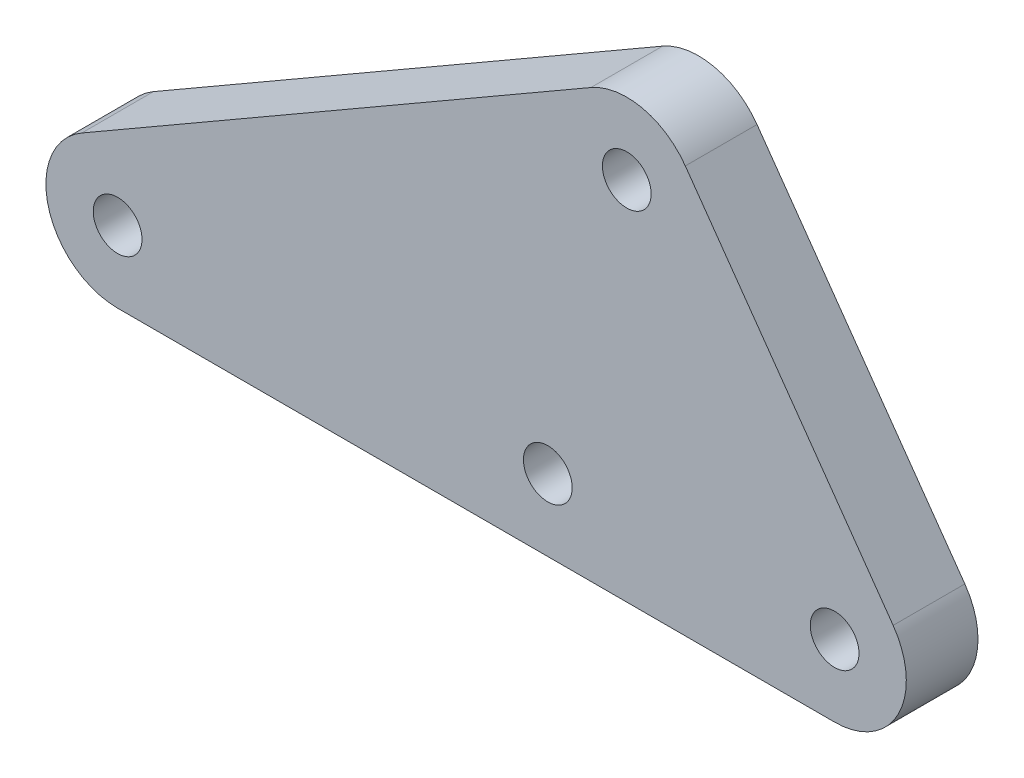
ISO-10303-21;
HEADER;
FILE_DESCRIPTION(('STEP AP214'),'2;1');
FILE_NAME('part.step','',(''),(''),'','','');
FILE_SCHEMA(('AUTOMOTIVE_DESIGN { 1 0 10303 214 1 1 1 1 }'));
ENDSEC;
DATA;
#1=APPLICATION_CONTEXT('core data for automotive mechanical design processes');
#2=APPLICATION_PROTOCOL_DEFINITION('international standard','automotive_design',2000,#1);
#3=PRODUCT_CONTEXT('',#1,'mechanical');
#4=PRODUCT('Part','Part','',(#3));
#5=PRODUCT_RELATED_PRODUCT_CATEGORY('part','',(#4));
#6=PRODUCT_DEFINITION_FORMATION('','',#4);
#7=PRODUCT_DEFINITION_CONTEXT('part definition',#1,'design');
#8=PRODUCT_DEFINITION('design','',#6,#7);
#9=PRODUCT_DEFINITION_SHAPE('','',#8);
#10=(LENGTH_UNIT() NAMED_UNIT(*) SI_UNIT(.MILLI.,.METRE.));
#11=(NAMED_UNIT(*) PLANE_ANGLE_UNIT() SI_UNIT($,.RADIAN.));
#12=(NAMED_UNIT(*) SI_UNIT($,.STERADIAN.) SOLID_ANGLE_UNIT());
#13=UNCERTAINTY_MEASURE_WITH_UNIT(LENGTH_MEASURE(1.E-05),#10,'distance_accuracy_value','');
#14=(GEOMETRIC_REPRESENTATION_CONTEXT(3) GLOBAL_UNCERTAINTY_ASSIGNED_CONTEXT((#13)) GLOBAL_UNIT_ASSIGNED_CONTEXT((#10,
#11,#12)) REPRESENTATION_CONTEXT('',''));
#15=CARTESIAN_POINT('',(0.,0.,0.));
#16=DIRECTION('',(0.,0.,1.));
#17=DIRECTION('',(1.,0.,0.));
#18=AXIS2_PLACEMENT_3D('',#15,#16,#17);
#19=CARTESIAN_POINT('',(-2.50000000000001,4.33012701892219,5.));
#20=DIRECTION('',(-0.500000000000001,0.866025403784438,0.));
#21=DIRECTION('',(-0.866025403784438,-0.500000000000001,0.));
#22=AXIS2_PLACEMENT_3D('',#19,#20,#21);
#23=PLANE('',#22);
#24=DIRECTION('',(0.866025403784438,0.500000000000001,0.));
#25=VECTOR('',#24,1.);
#26=CARTESIAN_POINT('',(-2.50000000000001,4.33012701892219,0.));
#27=LINE('',#26,#25);
#28=CARTESIAN_POINT('',(-2.50000000000001,4.33012701892219,0.));
#29=VERTEX_POINT('',#28);
#30=CARTESIAN_POINT('',(33.007041555162,24.8301270189223,0.));
#31=VERTEX_POINT('',#30);
#32=EDGE_CURVE('E130',#29,#31,#27,.T.);
#33=ORIENTED_EDGE('',*,*,#32,.F.);
#34=DIRECTION('',(0.,0.,-1.));
#35=VECTOR('',#34,1.);
#36=CARTESIAN_POINT('',(-2.50000000000001,4.33012701892219,5.));
#37=LINE('',#36,#35);
#38=CARTESIAN_POINT('',(-2.50000000000001,4.33012701892219,5.));
#39=VERTEX_POINT('',#38);
#40=EDGE_CURVE('E11',#39,#29,#37,.T.);
#41=ORIENTED_EDGE('',*,*,#40,.F.);
#42=DIRECTION('',(0.866025403784438,0.500000000000001,0.));
#43=VECTOR('',#42,1.);
#44=CARTESIAN_POINT('',(-2.50000000000001,4.33012701892219,5.));
#45=LINE('',#44,#43);
#46=CARTESIAN_POINT('',(33.007041555162,24.8301270189223,5.));
#47=VERTEX_POINT('',#46);
#48=EDGE_CURVE('E203',#39,#47,#45,.T.);
#49=ORIENTED_EDGE('',*,*,#48,.T.);
#50=DIRECTION('',(0.,0.,-1.));
#51=VECTOR('',#50,1.);
#52=CARTESIAN_POINT('',(33.007041555162,24.8301270189223,5.));
#53=LINE('',#52,#51);
#54=EDGE_CURVE('E80',#47,#31,#53,.T.);
#55=ORIENTED_EDGE('',*,*,#54,.T.);
#56=EDGE_LOOP('',(#33,#41,#49,#55));
#57=FACE_BOUND('',#56,.T.);
#58=ADVANCED_FACE('F35',(#57),#23,.T.);
#59=CARTESIAN_POINT('',(0.,0.,5.));
#60=DIRECTION('',(0.,0.,-1.));
#61=DIRECTION('',(-1.,0.,0.));
#62=AXIS2_PLACEMENT_3D('',#59,#60,#61);
#63=CYLINDRICAL_SURFACE('',#62,5.);
#64=CARTESIAN_POINT('',(0.,0.,0.));
#65=DIRECTION('',(0.,0.,1.));
#66=DIRECTION('',(1.,0.,0.));
#67=AXIS2_PLACEMENT_3D('',#64,#65,#66);
#68=CIRCLE('',#67,5.);
#69=CARTESIAN_POINT('',(0.,-5.,0.));
#70=VERTEX_POINT('',#69);
#71=EDGE_CURVE('E133',#29,#70,#68,.T.);
#72=ORIENTED_EDGE('',*,*,#71,.T.);
#73=DIRECTION('',(0.,0.,-1.));
#74=VECTOR('',#73,1.);
#75=CARTESIAN_POINT('',(0.,-5.,5.));
#76=LINE('',#75,#74);
#77=CARTESIAN_POINT('',(0.,-5.,5.));
#78=VERTEX_POINT('',#77);
#79=EDGE_CURVE('E44',#78,#70,#76,.T.);
#80=ORIENTED_EDGE('',*,*,#79,.F.);
#81=CARTESIAN_POINT('',(0.,0.,5.));
#82=DIRECTION('',(0.,0.,1.));
#83=DIRECTION('',(1.,0.,0.));
#84=AXIS2_PLACEMENT_3D('',#81,#82,#83);
#85=CIRCLE('',#84,5.);
#86=EDGE_CURVE('E205',#39,#78,#85,.T.);
#87=ORIENTED_EDGE('',*,*,#86,.F.);
#88=ORIENTED_EDGE('',*,*,#40,.T.);
#89=EDGE_LOOP('',(#72,#80,#87,#88));
#90=FACE_BOUND('',#89,.T.);
#91=ADVANCED_FACE('F162',(#90),#63,.T.);
#92=CARTESIAN_POINT('',(0.,-5.,5.));
#93=DIRECTION('',(0.,1.,0.));
#94=DIRECTION('',(-1.,0.,0.));
#95=AXIS2_PLACEMENT_3D('',#92,#93,#94);
#96=PLANE('',#95);
#97=DIRECTION('',(1.,0.,0.));
#98=VECTOR('',#97,1.);
#99=CARTESIAN_POINT('',(0.,-5.,0.));
#100=LINE('',#99,#98);
#101=CARTESIAN_POINT('',(50.,-5.,0.));
#102=VERTEX_POINT('',#101);
#103=EDGE_CURVE('E136',#70,#102,#100,.T.);
#104=ORIENTED_EDGE('',*,*,#103,.T.);
#105=DIRECTION('',(0.,0.,-1.));
#106=VECTOR('',#105,1.);
#107=CARTESIAN_POINT('',(50.,-5.,5.));
#108=LINE('',#107,#106);
#109=CARTESIAN_POINT('',(50.,-5.,5.));
#110=VERTEX_POINT('',#109);
#111=EDGE_CURVE('E111',#110,#102,#108,.T.);
#112=ORIENTED_EDGE('',*,*,#111,.F.);
#113=DIRECTION('',(1.,0.,0.));
#114=VECTOR('',#113,1.);
#115=CARTESIAN_POINT('',(0.,-5.,5.));
#116=LINE('',#115,#114);
#117=EDGE_CURVE('E99',#78,#110,#116,.T.);
#118=ORIENTED_EDGE('',*,*,#117,.F.);
#119=ORIENTED_EDGE('',*,*,#79,.T.);
#120=EDGE_LOOP('',(#104,#112,#118,#119));
#121=FACE_BOUND('',#120,.T.);
#122=ADVANCED_FACE('F159',(#121),#96,.F.);
#123=CARTESIAN_POINT('',(50.,0.,5.));
#124=DIRECTION('',(0.,0.,-1.));
#125=DIRECTION('',(-1.,0.,0.));
#126=AXIS2_PLACEMENT_3D('',#123,#124,#125);
#127=CYLINDRICAL_SURFACE('',#126,5.);
#128=CARTESIAN_POINT('',(50.,0.,0.));
#129=DIRECTION('',(0.,0.,1.));
#130=DIRECTION('',(1.,0.,0.));
#131=AXIS2_PLACEMENT_3D('',#128,#129,#130);
#132=CIRCLE('',#131,5.);
#133=CARTESIAN_POINT('',(54.0827392452916,2.8863887913717,0.));
#134=VERTEX_POINT('',#133);
#135=EDGE_CURVE('E107',#102,#134,#132,.T.);
#136=ORIENTED_EDGE('',*,*,#135,.T.);
#137=DIRECTION('',(0.,0.,-1.));
#138=VECTOR('',#137,1.);
#139=CARTESIAN_POINT('',(54.0827392452916,2.8863887913717,5.));
#140=LINE('',#139,#138);
#141=CARTESIAN_POINT('',(54.0827392452916,2.8863887913717,5.));
#142=VERTEX_POINT('',#141);
#143=EDGE_CURVE('E105',#142,#134,#140,.T.);
#144=ORIENTED_EDGE('',*,*,#143,.F.);
#145=CARTESIAN_POINT('',(50.,0.,5.));
#146=DIRECTION('',(0.,0.,1.));
#147=DIRECTION('',(1.,0.,0.));
#148=AXIS2_PLACEMENT_3D('',#145,#146,#147);
#149=CIRCLE('',#148,5.);
#150=EDGE_CURVE('E92',#110,#142,#149,.T.);
#151=ORIENTED_EDGE('',*,*,#150,.F.);
#152=ORIENTED_EDGE('',*,*,#111,.T.);
#153=EDGE_LOOP('',(#136,#144,#151,#152));
#154=FACE_BOUND('',#153,.T.);
#155=ADVANCED_FACE('F106',(#154),#127,.T.);
#156=CARTESIAN_POINT('',(37.4202587353792,26.4551343827774,5.));
#157=DIRECTION('',(0.816547849058311,0.577277758274339,0.));
#158=DIRECTION('',(-0.577277758274339,0.816547849058311,0.));
#159=AXIS2_PLACEMENT_3D('',#156,#157,#158);
#160=PLANE('',#159);
#161=DIRECTION('',(0.577277758274339,-0.816547849058311,0.));
#162=VECTOR('',#161,1.);
#163=CARTESIAN_POINT('',(37.4202587353792,26.4551343827774,0.));
#164=LINE('',#163,#162);
#165=CARTESIAN_POINT('',(39.5897808004535,23.3863887913718,0.));
#166=VERTEX_POINT('',#165);
#167=EDGE_CURVE('E140',#166,#134,#164,.T.);
#168=ORIENTED_EDGE('',*,*,#167,.F.);
#169=DIRECTION('',(0.,0.,-1.));
#170=VECTOR('',#169,1.);
#171=CARTESIAN_POINT('',(39.5897808004535,23.3863887913718,5.));
#172=LINE('',#171,#170);
#173=CARTESIAN_POINT('',(39.5897808004535,23.3863887913718,5.));
#174=VERTEX_POINT('',#173);
#175=EDGE_CURVE('E73',#174,#166,#172,.T.);
#176=ORIENTED_EDGE('',*,*,#175,.F.);
#177=DIRECTION('',(0.577277758274339,-0.816547849058311,0.));
#178=VECTOR('',#177,1.);
#179=CARTESIAN_POINT('',(37.4202587353792,26.4551343827774,5.));
#180=LINE('',#179,#178);
#181=EDGE_CURVE('E97',#174,#142,#180,.T.);
#182=ORIENTED_EDGE('',*,*,#181,.T.);
#183=ORIENTED_EDGE('',*,*,#143,.T.);
#184=EDGE_LOOP('',(#168,#176,#182,#183));
#185=FACE_BOUND('',#184,.T.);
#186=ADVANCED_FACE('F113',(#185),#160,.T.);
#187=CARTESIAN_POINT('',(0.,0.,5.));
#188=DIRECTION('',(0.,0.,-1.));
#189=DIRECTION('',(-1.,0.,0.));
#190=AXIS2_PLACEMENT_3D('',#187,#188,#189);
#191=CYLINDRICAL_SURFACE('',#190,1.7);
#192=CARTESIAN_POINT('',(0.,0.,5.));
#193=DIRECTION('',(0.,0.,1.));
#194=DIRECTION('',(1.,0.,0.));
#195=AXIS2_PLACEMENT_3D('',#192,#193,#194);
#196=CIRCLE('',#195,1.7);
#197=CARTESIAN_POINT('',(1.7,0.,5.));
#198=VERTEX_POINT('',#197);
#199=EDGE_CURVE('E121',#198,#198,#196,.T.);
#200=ORIENTED_EDGE('',*,*,#199,.T.);
#201=EDGE_LOOP('',(#200));
#202=FACE_BOUND('',#201,.T.);
#203=CARTESIAN_POINT('',(0.,0.,0.));
#204=DIRECTION('',(0.,0.,1.));
#205=DIRECTION('',(1.,0.,0.));
#206=AXIS2_PLACEMENT_3D('',#203,#204,#205);
#207=CIRCLE('',#206,1.7);
#208=CARTESIAN_POINT('',(1.7,0.,0.));
#209=VERTEX_POINT('',#208);
#210=EDGE_CURVE('E147',#209,#209,#207,.T.);
#211=ORIENTED_EDGE('',*,*,#210,.F.);
#212=EDGE_LOOP('',(#211));
#213=FACE_BOUND('',#212,.T.);
#214=ADVANCED_FACE('F178',(#202,#213),#191,.F.);
#215=CARTESIAN_POINT('',(30.,0.,5.));
#216=DIRECTION('',(0.,0.,-1.));
#217=DIRECTION('',(-1.,0.,0.));
#218=AXIS2_PLACEMENT_3D('',#215,#216,#217);
#219=CYLINDRICAL_SURFACE('',#218,1.70000000000001);
#220=CARTESIAN_POINT('',(30.,0.,5.));
#221=DIRECTION('',(0.,0.,1.));
#222=DIRECTION('',(1.,0.,0.));
#223=AXIS2_PLACEMENT_3D('',#220,#221,#222);
#224=CIRCLE('',#223,1.70000000000001);
#225=CARTESIAN_POINT('',(31.7,0.,5.));
#226=VERTEX_POINT('',#225);
#227=EDGE_CURVE('E115',#226,#226,#224,.T.);
#228=ORIENTED_EDGE('',*,*,#227,.T.);
#229=EDGE_LOOP('',(#228));
#230=FACE_BOUND('',#229,.T.);
#231=CARTESIAN_POINT('',(30.,0.,0.));
#232=DIRECTION('',(0.,0.,1.));
#233=DIRECTION('',(1.,0.,0.));
#234=AXIS2_PLACEMENT_3D('',#231,#232,#233);
#235=CIRCLE('',#234,1.70000000000001);
#236=CARTESIAN_POINT('',(31.7,0.,0.));
#237=VERTEX_POINT('',#236);
#238=EDGE_CURVE('E144',#237,#237,#235,.T.);
#239=ORIENTED_EDGE('',*,*,#238,.F.);
#240=EDGE_LOOP('',(#239));
#241=FACE_BOUND('',#240,.T.);
#242=ADVANCED_FACE('F182',(#230,#241),#219,.F.);
#243=CARTESIAN_POINT('',(35.507041555162,20.5000000000001,5.));
#244=DIRECTION('',(0.,0.,-1.));
#245=DIRECTION('',(-1.,0.,0.));
#246=AXIS2_PLACEMENT_3D('',#243,#244,#245);
#247=CYLINDRICAL_SURFACE('',#246,5.);
#248=CARTESIAN_POINT('',(35.507041555162,20.5000000000001,0.));
#249=DIRECTION('',(0.,0.,1.));
#250=DIRECTION('',(1.,0.,0.));
#251=AXIS2_PLACEMENT_3D('',#248,#249,#250);
#252=CIRCLE('',#251,5.);
#253=EDGE_CURVE('E142',#166,#31,#252,.T.);
#254=ORIENTED_EDGE('',*,*,#253,.T.);
#255=ORIENTED_EDGE('',*,*,#54,.F.);
#256=CARTESIAN_POINT('',(35.507041555162,20.5000000000001,5.));
#257=DIRECTION('',(0.,0.,1.));
#258=DIRECTION('',(1.,0.,0.));
#259=AXIS2_PLACEMENT_3D('',#256,#257,#258);
#260=CIRCLE('',#259,5.);
#261=EDGE_CURVE('E52',#174,#47,#260,.T.);
#262=ORIENTED_EDGE('',*,*,#261,.F.);
#263=ORIENTED_EDGE('',*,*,#175,.T.);
#264=EDGE_LOOP('',(#254,#255,#262,#263));
#265=FACE_BOUND('',#264,.T.);
#266=ADVANCED_FACE('F179',(#265),#247,.T.);
#267=CARTESIAN_POINT('',(35.507041555162,20.5000000000001,5.));
#268=DIRECTION('',(0.,0.,-1.));
#269=DIRECTION('',(-1.,0.,0.));
#270=AXIS2_PLACEMENT_3D('',#267,#268,#269);
#271=CYLINDRICAL_SURFACE('',#270,1.7);
#272=CARTESIAN_POINT('',(35.507041555162,20.5000000000001,5.));
#273=DIRECTION('',(0.,0.,1.));
#274=DIRECTION('',(1.,0.,0.));
#275=AXIS2_PLACEMENT_3D('',#272,#273,#274);
#276=CIRCLE('',#275,1.7);
#277=CARTESIAN_POINT('',(37.207041555162,20.5000000000001,5.));
#278=VERTEX_POINT('',#277);
#279=EDGE_CURVE('E153',#278,#278,#276,.T.);
#280=ORIENTED_EDGE('',*,*,#279,.T.);
#281=EDGE_LOOP('',(#280));
#282=FACE_BOUND('',#281,.T.);
#283=CARTESIAN_POINT('',(35.507041555162,20.5000000000001,0.));
#284=DIRECTION('',(0.,0.,1.));
#285=DIRECTION('',(1.,0.,0.));
#286=AXIS2_PLACEMENT_3D('',#283,#284,#285);
#287=CIRCLE('',#286,1.7);
#288=CARTESIAN_POINT('',(37.207041555162,20.5000000000001,0.));
#289=VERTEX_POINT('',#288);
#290=EDGE_CURVE('E127',#289,#289,#287,.T.);
#291=ORIENTED_EDGE('',*,*,#290,.F.);
#292=EDGE_LOOP('',(#291));
#293=FACE_BOUND('',#292,.T.);
#294=ADVANCED_FACE('F37',(#282,#293),#271,.F.);
#295=CARTESIAN_POINT('',(50.,0.,5.));
#296=DIRECTION('',(0.,0.,-1.));
#297=DIRECTION('',(-1.,0.,0.));
#298=AXIS2_PLACEMENT_3D('',#295,#296,#297);
#299=CYLINDRICAL_SURFACE('',#298,1.7);
#300=CARTESIAN_POINT('',(50.,0.,5.));
#301=DIRECTION('',(0.,0.,1.));
#302=DIRECTION('',(1.,0.,0.));
#303=AXIS2_PLACEMENT_3D('',#300,#301,#302);
#304=CIRCLE('',#303,1.7);
#305=CARTESIAN_POINT('',(51.7,0.,5.));
#306=VERTEX_POINT('',#305);
#307=EDGE_CURVE('E124',#306,#306,#304,.T.);
#308=ORIENTED_EDGE('',*,*,#307,.T.);
#309=EDGE_LOOP('',(#308));
#310=FACE_BOUND('',#309,.T.);
#311=CARTESIAN_POINT('',(50.,0.,0.));
#312=DIRECTION('',(0.,0.,1.));
#313=DIRECTION('',(1.,0.,0.));
#314=AXIS2_PLACEMENT_3D('',#311,#312,#313);
#315=CIRCLE('',#314,1.7);
#316=CARTESIAN_POINT('',(51.7,0.,0.));
#317=VERTEX_POINT('',#316);
#318=EDGE_CURVE('E150',#317,#317,#315,.T.);
#319=ORIENTED_EDGE('',*,*,#318,.F.);
#320=EDGE_LOOP('',(#319));
#321=FACE_BOUND('',#320,.T.);
#322=ADVANCED_FACE('F189',(#310,#321),#299,.F.);
#323=CARTESIAN_POINT('',(0.,0.,5.));
#324=DIRECTION('',(0.,0.,1.));
#325=DIRECTION('',(1.,0.,0.));
#326=AXIS2_PLACEMENT_3D('',#323,#324,#325);
#327=PLANE('',#326);
#328=ORIENTED_EDGE('',*,*,#279,.F.);
#329=EDGE_LOOP('',(#328));
#330=FACE_BOUND('',#329,.T.);
#331=ORIENTED_EDGE('',*,*,#48,.F.);
#332=ORIENTED_EDGE('',*,*,#86,.T.);
#333=ORIENTED_EDGE('',*,*,#117,.T.);
#334=ORIENTED_EDGE('',*,*,#150,.T.);
#335=ORIENTED_EDGE('',*,*,#181,.F.);
#336=ORIENTED_EDGE('',*,*,#261,.T.);
#337=EDGE_LOOP('',(#331,#332,#333,#334,#335,#336));
#338=FACE_BOUND('',#337,.T.);
#339=ORIENTED_EDGE('',*,*,#227,.F.);
#340=EDGE_LOOP('',(#339));
#341=FACE_BOUND('',#340,.T.);
#342=ORIENTED_EDGE('',*,*,#199,.F.);
#343=EDGE_LOOP('',(#342));
#344=FACE_BOUND('',#343,.T.);
#345=ORIENTED_EDGE('',*,*,#307,.F.);
#346=EDGE_LOOP('',(#345));
#347=FACE_BOUND('',#346,.T.);
#348=ADVANCED_FACE('F94',(#330,#338,#341,#344,#347),#327,.T.);
#349=CARTESIAN_POINT('',(0.,0.,0.));
#350=DIRECTION('',(0.,0.,1.));
#351=DIRECTION('',(1.,0.,0.));
#352=AXIS2_PLACEMENT_3D('',#349,#350,#351);
#353=PLANE('',#352);
#354=ORIENTED_EDGE('',*,*,#290,.T.);
#355=EDGE_LOOP('',(#354));
#356=FACE_BOUND('',#355,.T.);
#357=ORIENTED_EDGE('',*,*,#32,.T.);
#358=ORIENTED_EDGE('',*,*,#253,.F.);
#359=ORIENTED_EDGE('',*,*,#167,.T.);
#360=ORIENTED_EDGE('',*,*,#135,.F.);
#361=ORIENTED_EDGE('',*,*,#103,.F.);
#362=ORIENTED_EDGE('',*,*,#71,.F.);
#363=EDGE_LOOP('',(#357,#358,#359,#360,#361,#362));
#364=FACE_BOUND('',#363,.T.);
#365=ORIENTED_EDGE('',*,*,#238,.T.);
#366=EDGE_LOOP('',(#365));
#367=FACE_BOUND('',#366,.T.);
#368=ORIENTED_EDGE('',*,*,#210,.T.);
#369=EDGE_LOOP('',(#368));
#370=FACE_BOUND('',#369,.T.);
#371=ORIENTED_EDGE('',*,*,#318,.T.);
#372=EDGE_LOOP('',(#371));
#373=FACE_BOUND('',#372,.T.);
#374=ADVANCED_FACE('F164',(#356,#364,#367,#370,#373),#353,.F.);
#375=CLOSED_SHELL('',(#58,#91,#122,#155,#186,#214,#242,#266,#294,#322,#348,#374));
#376=MANIFOLD_SOLID_BREP('B2',#375);
#377=ADVANCED_BREP_SHAPE_REPRESENTATION('',(#18,#376),#14);
#378=SHAPE_DEFINITION_REPRESENTATION(#9,#377);
ENDSEC;
END-ISO-10303-21;
